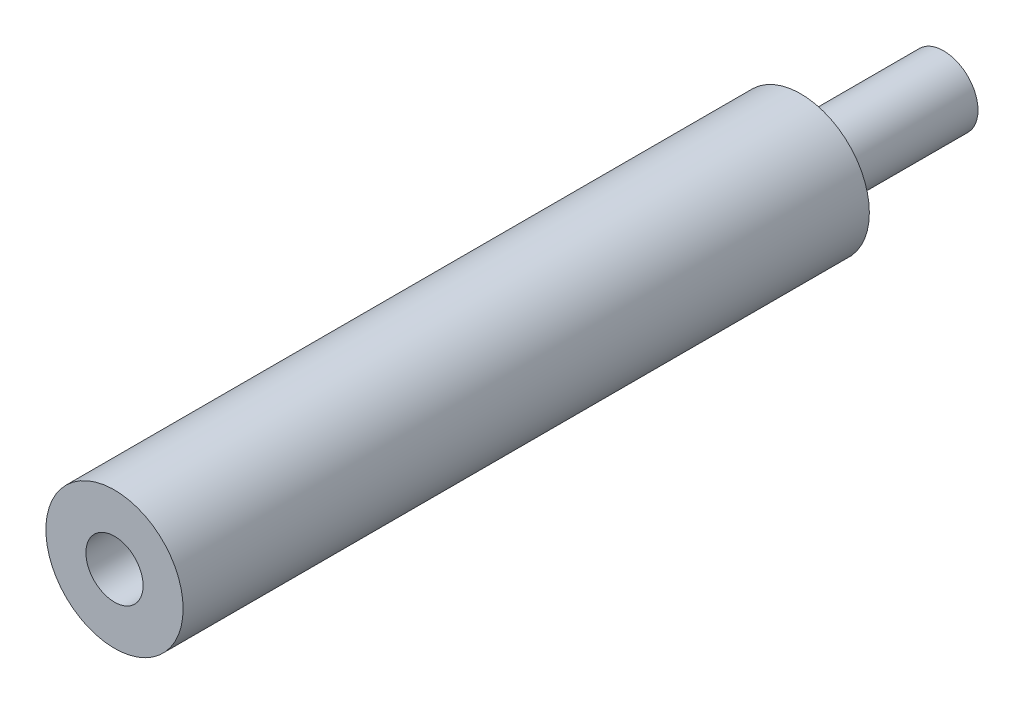
ISO-10303-21;
HEADER;
FILE_DESCRIPTION(('STEP AP214'),'2;1');
FILE_NAME('part.step','',(''),(''),'','','');
FILE_SCHEMA(('AUTOMOTIVE_DESIGN { 1 0 10303 214 1 1 1 1 }'));
ENDSEC;
DATA;
#1=APPLICATION_CONTEXT('core data for automotive mechanical design processes');
#2=APPLICATION_PROTOCOL_DEFINITION('international standard','automotive_design',2000,#1);
#3=PRODUCT_CONTEXT('',#1,'mechanical');
#4=PRODUCT('Part','Part','',(#3));
#5=PRODUCT_RELATED_PRODUCT_CATEGORY('part','',(#4));
#6=PRODUCT_DEFINITION_FORMATION('','',#4);
#7=PRODUCT_DEFINITION_CONTEXT('part definition',#1,'design');
#8=PRODUCT_DEFINITION('design','',#6,#7);
#9=PRODUCT_DEFINITION_SHAPE('','',#8);
#10=(LENGTH_UNIT() NAMED_UNIT(*) SI_UNIT(.MILLI.,.METRE.));
#11=(NAMED_UNIT(*) PLANE_ANGLE_UNIT() SI_UNIT($,.RADIAN.));
#12=(NAMED_UNIT(*) SI_UNIT($,.STERADIAN.) SOLID_ANGLE_UNIT());
#13=UNCERTAINTY_MEASURE_WITH_UNIT(LENGTH_MEASURE(1.E-05),#10,'distance_accuracy_value','');
#14=(GEOMETRIC_REPRESENTATION_CONTEXT(3) GLOBAL_UNCERTAINTY_ASSIGNED_CONTEXT((#13)) GLOBAL_UNIT_ASSIGNED_CONTEXT((#10,
#11,#12)) REPRESENTATION_CONTEXT('',''));
#15=CARTESIAN_POINT('',(0.,0.,0.));
#16=DIRECTION('',(0.,0.,1.));
#17=DIRECTION('',(1.,0.,0.));
#18=AXIS2_PLACEMENT_3D('',#15,#16,#17);
#19=CARTESIAN_POINT('',(0.,0.,30.));
#20=DIRECTION('',(0.,0.,-1.));
#21=DIRECTION('',(-1.,0.,0.));
#22=AXIS2_PLACEMENT_3D('',#19,#20,#21);
#23=CYLINDRICAL_SURFACE('',#22,5.99999999999999);
#24=CARTESIAN_POINT('',(0.,0.,30.));
#25=DIRECTION('',(0.,0.,1.));
#26=DIRECTION('',(1.,0.,0.));
#27=AXIS2_PLACEMENT_3D('',#24,#25,#26);
#28=CIRCLE('',#27,5.99999999999999);
#29=CARTESIAN_POINT('',(5.99999999999999,0.,30.));
#30=VERTEX_POINT('',#29);
#31=EDGE_CURVE('E44',#30,#30,#28,.T.);
#32=ORIENTED_EDGE('',*,*,#31,.F.);
#33=EDGE_LOOP('',(#32));
#34=FACE_BOUND('',#33,.T.);
#35=CARTESIAN_POINT('',(0.,0.,-30.));
#36=DIRECTION('',(0.,0.,1.));
#37=DIRECTION('',(1.,0.,0.));
#38=AXIS2_PLACEMENT_3D('',#35,#36,#37);
#39=CIRCLE('',#38,5.99999999999999);
#40=CARTESIAN_POINT('',(5.99999999999999,0.,-30.));
#41=VERTEX_POINT('',#40);
#42=EDGE_CURVE('E40',#41,#41,#39,.T.);
#43=ORIENTED_EDGE('',*,*,#42,.T.);
#44=EDGE_LOOP('',(#43));
#45=FACE_BOUND('',#44,.T.);
#46=ADVANCED_FACE('F37',(#34,#45),#23,.T.);
#47=CARTESIAN_POINT('',(0.,0.,30.));
#48=DIRECTION('',(0.,0.,1.));
#49=DIRECTION('',(1.,0.,0.));
#50=AXIS2_PLACEMENT_3D('',#47,#48,#49);
#51=PLANE('',#50);
#52=CARTESIAN_POINT('',(0.,0.,30.));
#53=DIRECTION('',(0.,0.,1.));
#54=DIRECTION('',(1.,0.,0.));
#55=AXIS2_PLACEMENT_3D('',#52,#53,#54);
#56=CIRCLE('',#55,2.5);
#57=CARTESIAN_POINT('',(2.50000000000001,0.,30.));
#58=VERTEX_POINT('',#57);
#59=EDGE_CURVE('E51',#58,#58,#56,.T.);
#60=ORIENTED_EDGE('',*,*,#59,.F.);
#61=EDGE_LOOP('',(#60));
#62=FACE_BOUND('',#61,.T.);
#63=ORIENTED_EDGE('',*,*,#31,.T.);
#64=EDGE_LOOP('',(#63));
#65=FACE_BOUND('',#64,.T.);
#66=ADVANCED_FACE('F67',(#62,#65),#51,.T.);
#67=CARTESIAN_POINT('',(0.,0.,-30.));
#68=DIRECTION('',(0.,0.,1.));
#69=DIRECTION('',(1.,0.,0.));
#70=AXIS2_PLACEMENT_3D('',#67,#68,#69);
#71=PLANE('',#70);
#72=CARTESIAN_POINT('',(0.,0.,-30.));
#73=DIRECTION('',(0.,0.,-1.));
#74=DIRECTION('',(-1.,0.,0.));
#75=AXIS2_PLACEMENT_3D('',#72,#73,#74);
#76=CIRCLE('',#75,2.99999999999999);
#77=CARTESIAN_POINT('',(-2.99999999999999,0.,-30.));
#78=VERTEX_POINT('',#77);
#79=EDGE_CURVE('E10',#78,#78,#76,.T.);
#80=ORIENTED_EDGE('',*,*,#79,.F.);
#81=EDGE_LOOP('',(#80));
#82=FACE_BOUND('',#81,.T.);
#83=ORIENTED_EDGE('',*,*,#42,.F.);
#84=EDGE_LOOP('',(#83));
#85=FACE_BOUND('',#84,.T.);
#86=ADVANCED_FACE('F70',(#82,#85),#71,.F.);
#87=CARTESIAN_POINT('',(0.,0.,-55.9852813742391));
#88=DIRECTION('',(0.,0.,1.));
#89=DIRECTION('',(1.,0.,0.));
#90=AXIS2_PLACEMENT_3D('',#87,#88,#89);
#91=CYLINDRICAL_SURFACE('',#90,2.99999999999999);
#92=CARTESIAN_POINT('',(0.,0.,-42.5000000000006));
#93=DIRECTION('',(0.,0.,1.));
#94=DIRECTION('',(1.,0.,0.));
#95=AXIS2_PLACEMENT_3D('',#92,#93,#94);
#96=CIRCLE('',#95,2.99999999999999);
#97=CARTESIAN_POINT('',(2.99999999999999,0.,-42.5000000000006));
#98=VERTEX_POINT('',#97);
#99=EDGE_CURVE('E53',#98,#98,#96,.T.);
#100=ORIENTED_EDGE('',*,*,#99,.T.);
#101=EDGE_LOOP('',(#100));
#102=FACE_BOUND('',#101,.T.);
#103=ORIENTED_EDGE('',*,*,#79,.T.);
#104=EDGE_LOOP('',(#103));
#105=FACE_BOUND('',#104,.T.);
#106=ADVANCED_FACE('F79',(#102,#105),#91,.T.);
#107=CARTESIAN_POINT('',(-57.5000000000003,22.,-42.5000000000002));
#108=DIRECTION('',(0.,0.,1.));
#109=DIRECTION('',(1.,0.,0.));
#110=AXIS2_PLACEMENT_3D('',#107,#108,#109);
#111=PLANE('',#110);
#112=ORIENTED_EDGE('',*,*,#99,.F.);
#113=EDGE_LOOP('',(#112));
#114=FACE_BOUND('',#113,.T.);
#115=ADVANCED_FACE('F84',(#114),#111,.F.);
#116=CARTESIAN_POINT('',(0.,0.,20.));
#117=DIRECTION('',(0.,0.,1.));
#118=DIRECTION('',(1.,0.,0.));
#119=AXIS2_PLACEMENT_3D('',#116,#117,#118);
#120=CYLINDRICAL_SURFACE('',#119,2.5);
#121=CARTESIAN_POINT('',(0.,0.,20.));
#122=DIRECTION('',(0.,0.,1.));
#123=DIRECTION('',(1.,0.,0.));
#124=AXIS2_PLACEMENT_3D('',#121,#122,#123);
#125=CIRCLE('',#124,2.5);
#126=CARTESIAN_POINT('',(2.50000000000001,0.,20.));
#127=VERTEX_POINT('',#126);
#128=EDGE_CURVE('E55',#127,#127,#125,.T.);
#129=ORIENTED_EDGE('',*,*,#128,.F.);
#130=EDGE_LOOP('',(#129));
#131=FACE_BOUND('',#130,.T.);
#132=ORIENTED_EDGE('',*,*,#59,.T.);
#133=EDGE_LOOP('',(#132));
#134=FACE_BOUND('',#133,.T.);
#135=ADVANCED_FACE('F65',(#131,#134),#120,.F.);
#136=CARTESIAN_POINT('',(0.,0.,20.));
#137=DIRECTION('',(0.,0.,1.));
#138=DIRECTION('',(1.,0.,0.));
#139=AXIS2_PLACEMENT_3D('',#136,#137,#138);
#140=PLANE('',#139);
#141=ORIENTED_EDGE('',*,*,#128,.T.);
#142=EDGE_LOOP('',(#141));
#143=FACE_BOUND('',#142,.T.);
#144=ADVANCED_FACE('F92',(#143),#140,.T.);
#145=CLOSED_SHELL('',(#46,#66,#86,#106,#115,#135,#144));
#146=MANIFOLD_SOLID_BREP('B2',#145);
#147=ADVANCED_BREP_SHAPE_REPRESENTATION('',(#18,#146),#14);
#148=SHAPE_DEFINITION_REPRESENTATION(#9,#147);
ENDSEC;
END-ISO-10303-21;
